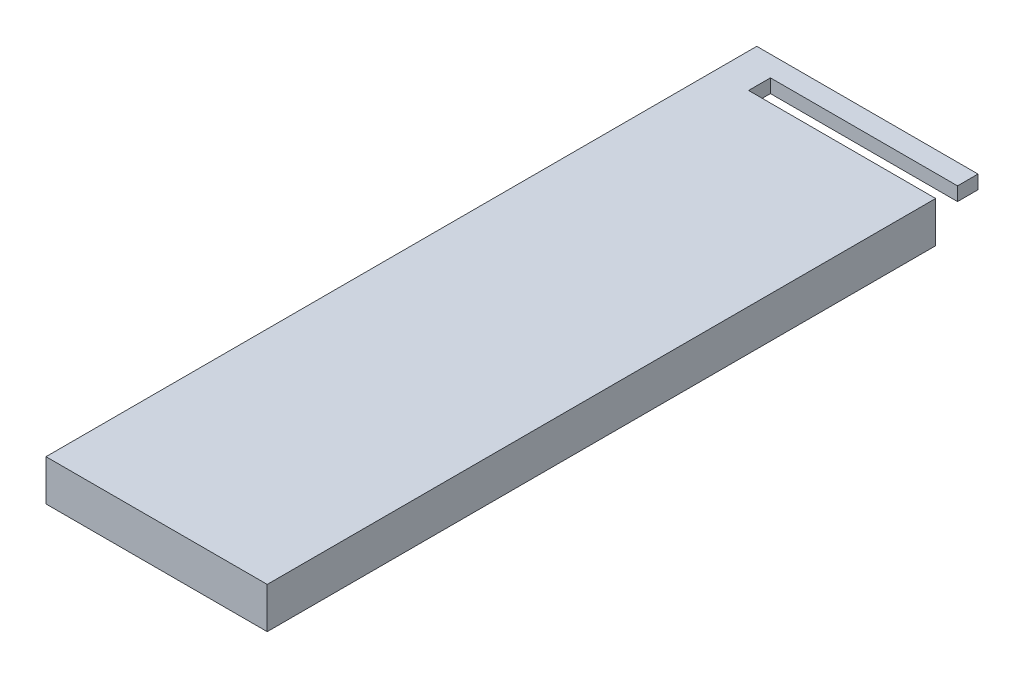
ISO-10303-21;
HEADER;
FILE_DESCRIPTION(('STEP AP214'),'2;1');
FILE_NAME('part.step','',(''),(''),'','','');
FILE_SCHEMA(('AUTOMOTIVE_DESIGN { 1 0 10303 214 1 1 1 1 }'));
ENDSEC;
DATA;
#1=APPLICATION_CONTEXT('core data for automotive mechanical design processes');
#2=APPLICATION_PROTOCOL_DEFINITION('international standard','automotive_design',2000,#1);
#3=PRODUCT_CONTEXT('',#1,'mechanical');
#4=PRODUCT('Part','Part','',(#3));
#5=PRODUCT_RELATED_PRODUCT_CATEGORY('part','',(#4));
#6=PRODUCT_DEFINITION_FORMATION('','',#4);
#7=PRODUCT_DEFINITION_CONTEXT('part definition',#1,'design');
#8=PRODUCT_DEFINITION('design','',#6,#7);
#9=PRODUCT_DEFINITION_SHAPE('','',#8);
#10=(LENGTH_UNIT() NAMED_UNIT(*) SI_UNIT(.MILLI.,.METRE.));
#11=(NAMED_UNIT(*) PLANE_ANGLE_UNIT() SI_UNIT($,.RADIAN.));
#12=(NAMED_UNIT(*) SI_UNIT($,.STERADIAN.) SOLID_ANGLE_UNIT());
#13=UNCERTAINTY_MEASURE_WITH_UNIT(LENGTH_MEASURE(1.E-05),#10,'distance_accuracy_value','');
#14=(GEOMETRIC_REPRESENTATION_CONTEXT(3) GLOBAL_UNCERTAINTY_ASSIGNED_CONTEXT((#13)) GLOBAL_UNIT_ASSIGNED_CONTEXT((#10,
#11,#12)) REPRESENTATION_CONTEXT('',''));
#15=CARTESIAN_POINT('',(0.,0.,0.));
#16=DIRECTION('',(0.,0.,1.));
#17=DIRECTION('',(1.,0.,0.));
#18=AXIS2_PLACEMENT_3D('',#15,#16,#17);
#19=CARTESIAN_POINT('',(30.4,2.,-95.9));
#20=DIRECTION('',(0.,0.,1.));
#21=DIRECTION('',(1.,0.,0.));
#22=AXIS2_PLACEMENT_3D('',#19,#20,#21);
#23=PLANE('',#22);
#24=DIRECTION('',(0.,-1.,0.));
#25=VECTOR('',#24,1.);
#26=CARTESIAN_POINT('',(5.,2.,-95.9));
#27=LINE('',#26,#25);
#28=CARTESIAN_POINT('',(5.,2.,-95.9));
#29=VERTEX_POINT('',#28);
#30=CARTESIAN_POINT('',(5.,0.,-95.9));
#31=VERTEX_POINT('',#30);
#32=EDGE_CURVE('E52',#29,#31,#27,.T.);
#33=ORIENTED_EDGE('',*,*,#32,.F.);
#34=DIRECTION('',(-1.,0.,0.));
#35=VECTOR('',#34,1.);
#36=CARTESIAN_POINT('',(30.4,2.,-95.9));
#37=LINE('',#36,#35);
#38=CARTESIAN_POINT('',(32.4,2.,-95.9));
#39=VERTEX_POINT('',#38);
#40=EDGE_CURVE('E11',#39,#29,#37,.T.);
#41=ORIENTED_EDGE('',*,*,#40,.F.);
#42=DIRECTION('',(0.,1.,0.));
#43=VECTOR('',#42,1.);
#44=CARTESIAN_POINT('',(32.4,-4.,-95.9));
#45=LINE('',#44,#43);
#46=CARTESIAN_POINT('',(32.4,-4.,-95.9));
#47=VERTEX_POINT('',#46);
#48=EDGE_CURVE('E181',#47,#39,#45,.T.);
#49=ORIENTED_EDGE('',*,*,#48,.F.);
#50=DIRECTION('',(1.,0.,0.));
#51=VECTOR('',#50,1.);
#52=CARTESIAN_POINT('',(0.,-4.,-95.9));
#53=LINE('',#52,#51);
#54=CARTESIAN_POINT('',(30.4,-4.,-95.9));
#55=VERTEX_POINT('',#54);
#56=EDGE_CURVE('E162',#55,#47,#53,.T.);
#57=ORIENTED_EDGE('',*,*,#56,.F.);
#58=DIRECTION('',(0.,1.,0.));
#59=VECTOR('',#58,1.);
#60=CARTESIAN_POINT('',(30.4,-4.,-95.9));
#61=LINE('',#60,#59);
#62=CARTESIAN_POINT('',(30.4,0.,-95.9));
#63=VERTEX_POINT('',#62);
#64=EDGE_CURVE('E178',#55,#63,#61,.T.);
#65=ORIENTED_EDGE('',*,*,#64,.T.);
#66=DIRECTION('',(-1.,0.,0.));
#67=VECTOR('',#66,1.);
#68=CARTESIAN_POINT('',(30.4,0.,-95.9));
#69=LINE('',#68,#67);
#70=EDGE_CURVE('E39',#63,#31,#69,.T.);
#71=ORIENTED_EDGE('',*,*,#70,.T.);
#72=EDGE_LOOP('',(#33,#41,#49,#57,#65,#71));
#73=FACE_BOUND('',#72,.T.);
#74=ADVANCED_FACE('F35',(#73),#23,.F.);
#75=CARTESIAN_POINT('',(0.,2.,0.));
#76=DIRECTION('',(1.,0.,0.));
#77=DIRECTION('',(0.,0.,-1.));
#78=AXIS2_PLACEMENT_3D('',#75,#76,#77);
#79=PLANE('',#78);
#80=DIRECTION('',(0.,0.,1.));
#81=VECTOR('',#80,1.);
#82=CARTESIAN_POINT('',(0.,0.,0.));
#83=LINE('',#82,#81);
#84=CARTESIAN_POINT('',(0.,0.,-102.1));
#85=VERTEX_POINT('',#84);
#86=CARTESIAN_POINT('',(0.,0.,0.));
#87=VERTEX_POINT('',#86);
#88=EDGE_CURVE('E174',#85,#87,#83,.T.);
#89=ORIENTED_EDGE('',*,*,#88,.T.);
#90=DIRECTION('',(0.,1.,0.));
#91=VECTOR('',#90,1.);
#92=CARTESIAN_POINT('',(0.,-4.,0.));
#93=LINE('',#92,#91);
#94=CARTESIAN_POINT('',(0.,-4.,0.));
#95=VERTEX_POINT('',#94);
#96=EDGE_CURVE('E171',#95,#87,#93,.T.);
#97=ORIENTED_EDGE('',*,*,#96,.F.);
#98=DIRECTION('',(0.,0.,-1.));
#99=VECTOR('',#98,1.);
#100=CARTESIAN_POINT('',(0.,-4.,0.));
#101=LINE('',#100,#99);
#102=CARTESIAN_POINT('',(0.,-4.,2.));
#103=VERTEX_POINT('',#102);
#104=EDGE_CURVE('E154',#103,#95,#101,.T.);
#105=ORIENTED_EDGE('',*,*,#104,.F.);
#106=DIRECTION('',(0.,1.,0.));
#107=VECTOR('',#106,1.);
#108=CARTESIAN_POINT('',(0.,-4.,2.));
#109=LINE('',#108,#107);
#110=CARTESIAN_POINT('',(0.,2.,2.));
#111=VERTEX_POINT('',#110);
#112=EDGE_CURVE('E125',#103,#111,#109,.T.);
#113=ORIENTED_EDGE('',*,*,#112,.T.);
#114=DIRECTION('',(0.,0.,1.));
#115=VECTOR('',#114,1.);
#116=CARTESIAN_POINT('',(0.,2.,0.));
#117=LINE('',#116,#115);
#118=CARTESIAN_POINT('',(0.,2.,-102.1));
#119=VERTEX_POINT('',#118);
#120=EDGE_CURVE('E44',#119,#111,#117,.T.);
#121=ORIENTED_EDGE('',*,*,#120,.F.);
#122=DIRECTION('',(0.,-1.,0.));
#123=VECTOR('',#122,1.);
#124=CARTESIAN_POINT('',(0.,2.,-102.1));
#125=LINE('',#124,#123);
#126=EDGE_CURVE('E122',#119,#85,#125,.T.);
#127=ORIENTED_EDGE('',*,*,#126,.T.);
#128=EDGE_LOOP('',(#89,#97,#105,#113,#121,#127));
#129=FACE_BOUND('',#128,.T.);
#130=ADVANCED_FACE('F37',(#129),#79,.F.);
#131=CARTESIAN_POINT('',(0.,2.,0.));
#132=DIRECTION('',(0.,1.,0.));
#133=DIRECTION('',(0.,0.,1.));
#134=AXIS2_PLACEMENT_3D('',#131,#132,#133);
#135=PLANE('',#134);
#136=ORIENTED_EDGE('',*,*,#40,.T.);
#137=DIRECTION('',(0.,0.,-1.));
#138=VECTOR('',#137,1.);
#139=CARTESIAN_POINT('',(5.,2.,0.));
#140=LINE('',#139,#138);
#141=CARTESIAN_POINT('',(5.,2.,-99.1));
#142=VERTEX_POINT('',#141);
#143=EDGE_CURVE('E146',#29,#142,#140,.T.);
#144=ORIENTED_EDGE('',*,*,#143,.T.);
#145=DIRECTION('',(-1.,0.,0.));
#146=VECTOR('',#145,1.);
#147=CARTESIAN_POINT('',(0.,2.,-99.1));
#148=LINE('',#147,#146);
#149=CARTESIAN_POINT('',(32.4,2.,-99.1));
#150=VERTEX_POINT('',#149);
#151=EDGE_CURVE('E150',#150,#142,#148,.T.);
#152=ORIENTED_EDGE('',*,*,#151,.F.);
#153=DIRECTION('',(0.,0.,-1.));
#154=VECTOR('',#153,1.);
#155=CARTESIAN_POINT('',(32.4,2.,0.));
#156=LINE('',#155,#154);
#157=CARTESIAN_POINT('',(32.4,2.,-102.1));
#158=VERTEX_POINT('',#157);
#159=EDGE_CURVE('E135',#150,#158,#156,.T.);
#160=ORIENTED_EDGE('',*,*,#159,.T.);
#161=DIRECTION('',(-1.,0.,0.));
#162=VECTOR('',#161,1.);
#163=CARTESIAN_POINT('',(0.,2.,-102.1));
#164=LINE('',#163,#162);
#165=EDGE_CURVE('E131',#158,#119,#164,.T.);
#166=ORIENTED_EDGE('',*,*,#165,.T.);
#167=ORIENTED_EDGE('',*,*,#120,.T.);
#168=DIRECTION('',(-1.,0.,0.));
#169=VECTOR('',#168,1.);
#170=CARTESIAN_POINT('',(0.,2.,2.));
#171=LINE('',#170,#169);
#172=CARTESIAN_POINT('',(32.4,2.,2.));
#173=VERTEX_POINT('',#172);
#174=EDGE_CURVE('E168',#173,#111,#171,.T.);
#175=ORIENTED_EDGE('',*,*,#174,.F.);
#176=DIRECTION('',(0.,0.,1.));
#177=VECTOR('',#176,1.);
#178=CARTESIAN_POINT('',(32.4,2.,0.));
#179=LINE('',#178,#177);
#180=EDGE_CURVE('E158',#39,#173,#179,.T.);
#181=ORIENTED_EDGE('',*,*,#180,.F.);
#182=EDGE_LOOP('',(#136,#144,#152,#160,#166,#167,#175,#181));
#183=FACE_BOUND('',#182,.T.);
#184=ADVANCED_FACE('F132',(#183),#135,.T.);
#185=CARTESIAN_POINT('',(0.,0.,0.));
#186=DIRECTION('',(0.,1.,0.));
#187=DIRECTION('',(0.,0.,1.));
#188=AXIS2_PLACEMENT_3D('',#185,#186,#187);
#189=PLANE('',#188);
#190=ORIENTED_EDGE('',*,*,#88,.F.);
#191=DIRECTION('',(-1.,0.,0.));
#192=VECTOR('',#191,1.);
#193=CARTESIAN_POINT('',(0.,0.,-102.1));
#194=LINE('',#193,#192);
#195=CARTESIAN_POINT('',(32.4,0.,-102.1));
#196=VERTEX_POINT('',#195);
#197=EDGE_CURVE('E144',#196,#85,#194,.T.);
#198=ORIENTED_EDGE('',*,*,#197,.F.);
#199=DIRECTION('',(0.,0.,-1.));
#200=VECTOR('',#199,1.);
#201=CARTESIAN_POINT('',(32.4,0.,0.));
#202=LINE('',#201,#200);
#203=CARTESIAN_POINT('',(32.4,0.,-99.1));
#204=VERTEX_POINT('',#203);
#205=EDGE_CURVE('E207',#204,#196,#202,.T.);
#206=ORIENTED_EDGE('',*,*,#205,.F.);
#207=DIRECTION('',(-1.,0.,0.));
#208=VECTOR('',#207,1.);
#209=CARTESIAN_POINT('',(0.,0.,-99.1));
#210=LINE('',#209,#208);
#211=CARTESIAN_POINT('',(5.,0.,-99.1));
#212=VERTEX_POINT('',#211);
#213=EDGE_CURVE('E205',#204,#212,#210,.T.);
#214=ORIENTED_EDGE('',*,*,#213,.T.);
#215=DIRECTION('',(0.,0.,-1.));
#216=VECTOR('',#215,1.);
#217=CARTESIAN_POINT('',(5.,0.,0.));
#218=LINE('',#217,#216);
#219=EDGE_CURVE('E139',#31,#212,#218,.T.);
#220=ORIENTED_EDGE('',*,*,#219,.F.);
#221=ORIENTED_EDGE('',*,*,#70,.F.);
#222=DIRECTION('',(0.,0.,-1.));
#223=VECTOR('',#222,1.);
#224=CARTESIAN_POINT('',(30.4,0.,0.));
#225=LINE('',#224,#223);
#226=CARTESIAN_POINT('',(30.4,0.,0.));
#227=VERTEX_POINT('',#226);
#228=EDGE_CURVE('E59',#227,#63,#225,.T.);
#229=ORIENTED_EDGE('',*,*,#228,.F.);
#230=DIRECTION('',(1.,0.,0.));
#231=VECTOR('',#230,1.);
#232=CARTESIAN_POINT('',(0.,0.,0.));
#233=LINE('',#232,#231);
#234=EDGE_CURVE('E189',#87,#227,#233,.T.);
#235=ORIENTED_EDGE('',*,*,#234,.F.);
#236=EDGE_LOOP('',(#190,#198,#206,#214,#220,#221,#229,#235));
#237=FACE_BOUND('',#236,.T.);
#238=ADVANCED_FACE('F202',(#237),#189,.F.);
#239=CARTESIAN_POINT('',(0.,-4.,0.));
#240=DIRECTION('',(0.,0.,1.));
#241=DIRECTION('',(1.,0.,0.));
#242=AXIS2_PLACEMENT_3D('',#239,#240,#241);
#243=PLANE('',#242);
#244=ORIENTED_EDGE('',*,*,#96,.T.);
#245=ORIENTED_EDGE('',*,*,#234,.T.);
#246=DIRECTION('',(0.,1.,0.));
#247=VECTOR('',#246,1.);
#248=CARTESIAN_POINT('',(30.4,-4.,0.));
#249=LINE('',#248,#247);
#250=CARTESIAN_POINT('',(30.4,-4.,0.));
#251=VERTEX_POINT('',#250);
#252=EDGE_CURVE('E175',#251,#227,#249,.T.);
#253=ORIENTED_EDGE('',*,*,#252,.F.);
#254=DIRECTION('',(1.,0.,0.));
#255=VECTOR('',#254,1.);
#256=CARTESIAN_POINT('',(0.,-4.,0.));
#257=LINE('',#256,#255);
#258=EDGE_CURVE('E166',#95,#251,#257,.T.);
#259=ORIENTED_EDGE('',*,*,#258,.F.);
#260=EDGE_LOOP('',(#244,#245,#253,#259));
#261=FACE_BOUND('',#260,.T.);
#262=ADVANCED_FACE('F232',(#261),#243,.F.);
#263=CARTESIAN_POINT('',(30.4,-4.,0.));
#264=DIRECTION('',(1.,0.,0.));
#265=DIRECTION('',(0.,0.,-1.));
#266=AXIS2_PLACEMENT_3D('',#263,#264,#265);
#267=PLANE('',#266);
#268=ORIENTED_EDGE('',*,*,#252,.T.);
#269=ORIENTED_EDGE('',*,*,#228,.T.);
#270=ORIENTED_EDGE('',*,*,#64,.F.);
#271=DIRECTION('',(0.,0.,-1.));
#272=VECTOR('',#271,1.);
#273=CARTESIAN_POINT('',(30.4,-4.,0.));
#274=LINE('',#273,#272);
#275=EDGE_CURVE('E164',#251,#55,#274,.T.);
#276=ORIENTED_EDGE('',*,*,#275,.F.);
#277=EDGE_LOOP('',(#268,#269,#270,#276));
#278=FACE_BOUND('',#277,.T.);
#279=ADVANCED_FACE('F230',(#278),#267,.F.);
#280=CARTESIAN_POINT('',(32.4,-4.,0.));
#281=DIRECTION('',(-1.,0.,0.));
#282=DIRECTION('',(0.,0.,1.));
#283=AXIS2_PLACEMENT_3D('',#280,#281,#282);
#284=PLANE('',#283);
#285=ORIENTED_EDGE('',*,*,#180,.T.);
#286=DIRECTION('',(0.,1.,0.));
#287=VECTOR('',#286,1.);
#288=CARTESIAN_POINT('',(32.4,-4.,2.));
#289=LINE('',#288,#287);
#290=CARTESIAN_POINT('',(32.4,-4.,2.));
#291=VERTEX_POINT('',#290);
#292=EDGE_CURVE('E184',#291,#173,#289,.T.);
#293=ORIENTED_EDGE('',*,*,#292,.F.);
#294=DIRECTION('',(0.,0.,1.));
#295=VECTOR('',#294,1.);
#296=CARTESIAN_POINT('',(32.4,-4.,0.));
#297=LINE('',#296,#295);
#298=EDGE_CURVE('E160',#47,#291,#297,.T.);
#299=ORIENTED_EDGE('',*,*,#298,.F.);
#300=ORIENTED_EDGE('',*,*,#48,.T.);
#301=EDGE_LOOP('',(#285,#293,#299,#300));
#302=FACE_BOUND('',#301,.T.);
#303=ADVANCED_FACE('F223',(#302),#284,.F.);
#304=CARTESIAN_POINT('',(0.,-4.,2.));
#305=DIRECTION('',(0.,0.,-1.));
#306=DIRECTION('',(-1.,0.,0.));
#307=AXIS2_PLACEMENT_3D('',#304,#305,#306);
#308=PLANE('',#307);
#309=ORIENTED_EDGE('',*,*,#174,.T.);
#310=ORIENTED_EDGE('',*,*,#112,.F.);
#311=DIRECTION('',(-1.,0.,0.));
#312=VECTOR('',#311,1.);
#313=CARTESIAN_POINT('',(0.,-4.,2.));
#314=LINE('',#313,#312);
#315=EDGE_CURVE('E157',#291,#103,#314,.T.);
#316=ORIENTED_EDGE('',*,*,#315,.F.);
#317=ORIENTED_EDGE('',*,*,#292,.T.);
#318=EDGE_LOOP('',(#309,#310,#316,#317));
#319=FACE_BOUND('',#318,.T.);
#320=ADVANCED_FACE('F238',(#319),#308,.F.);
#321=CARTESIAN_POINT('',(0.,-4.,0.));
#322=DIRECTION('',(0.,1.,0.));
#323=DIRECTION('',(0.,0.,1.));
#324=AXIS2_PLACEMENT_3D('',#321,#322,#323);
#325=PLANE('',#324);
#326=ORIENTED_EDGE('',*,*,#104,.T.);
#327=ORIENTED_EDGE('',*,*,#258,.T.);
#328=ORIENTED_EDGE('',*,*,#275,.T.);
#329=ORIENTED_EDGE('',*,*,#56,.T.);
#330=ORIENTED_EDGE('',*,*,#298,.T.);
#331=ORIENTED_EDGE('',*,*,#315,.T.);
#332=EDGE_LOOP('',(#326,#327,#328,#329,#330,#331));
#333=FACE_BOUND('',#332,.T.);
#334=ADVANCED_FACE('F227',(#333),#325,.F.);
#335=CARTESIAN_POINT('',(5.,2.,0.));
#336=DIRECTION('',(-1.,0.,0.));
#337=DIRECTION('',(0.,0.,1.));
#338=AXIS2_PLACEMENT_3D('',#335,#336,#337);
#339=PLANE('',#338);
#340=ORIENTED_EDGE('',*,*,#219,.T.);
#341=DIRECTION('',(0.,-1.,0.));
#342=VECTOR('',#341,1.);
#343=CARTESIAN_POINT('',(5.,2.,-99.1));
#344=LINE('',#343,#342);
#345=EDGE_CURVE('E200',#142,#212,#344,.T.);
#346=ORIENTED_EDGE('',*,*,#345,.F.);
#347=ORIENTED_EDGE('',*,*,#143,.F.);
#348=ORIENTED_EDGE('',*,*,#32,.T.);
#349=EDGE_LOOP('',(#340,#346,#347,#348));
#350=FACE_BOUND('',#349,.T.);
#351=ADVANCED_FACE('F197',(#350),#339,.F.);
#352=CARTESIAN_POINT('',(0.,2.,-99.1));
#353=DIRECTION('',(0.,0.,1.));
#354=DIRECTION('',(1.,0.,0.));
#355=AXIS2_PLACEMENT_3D('',#352,#353,#354);
#356=PLANE('',#355);
#357=ORIENTED_EDGE('',*,*,#213,.F.);
#358=DIRECTION('',(0.,-1.,0.));
#359=VECTOR('',#358,1.);
#360=CARTESIAN_POINT('',(32.4,2.,-99.1));
#361=LINE('',#360,#359);
#362=EDGE_CURVE('E148',#150,#204,#361,.T.);
#363=ORIENTED_EDGE('',*,*,#362,.F.);
#364=ORIENTED_EDGE('',*,*,#151,.T.);
#365=ORIENTED_EDGE('',*,*,#345,.T.);
#366=EDGE_LOOP('',(#357,#363,#364,#365));
#367=FACE_BOUND('',#366,.T.);
#368=ADVANCED_FACE('F215',(#367),#356,.T.);
#369=CARTESIAN_POINT('',(32.4,2.,0.));
#370=DIRECTION('',(-1.,0.,0.));
#371=DIRECTION('',(0.,0.,1.));
#372=AXIS2_PLACEMENT_3D('',#369,#370,#371);
#373=PLANE('',#372);
#374=ORIENTED_EDGE('',*,*,#205,.T.);
#375=DIRECTION('',(0.,-1.,0.));
#376=VECTOR('',#375,1.);
#377=CARTESIAN_POINT('',(32.4,2.,-102.1));
#378=LINE('',#377,#376);
#379=EDGE_CURVE('E145',#158,#196,#378,.T.);
#380=ORIENTED_EDGE('',*,*,#379,.F.);
#381=ORIENTED_EDGE('',*,*,#159,.F.);
#382=ORIENTED_EDGE('',*,*,#362,.T.);
#383=EDGE_LOOP('',(#374,#380,#381,#382));
#384=FACE_BOUND('',#383,.T.);
#385=ADVANCED_FACE('F212',(#384),#373,.F.);
#386=CARTESIAN_POINT('',(0.,2.,-102.1));
#387=DIRECTION('',(0.,0.,1.));
#388=DIRECTION('',(1.,0.,0.));
#389=AXIS2_PLACEMENT_3D('',#386,#387,#388);
#390=PLANE('',#389);
#391=ORIENTED_EDGE('',*,*,#197,.T.);
#392=ORIENTED_EDGE('',*,*,#126,.F.);
#393=ORIENTED_EDGE('',*,*,#165,.F.);
#394=ORIENTED_EDGE('',*,*,#379,.T.);
#395=EDGE_LOOP('',(#391,#392,#393,#394));
#396=FACE_BOUND('',#395,.T.);
#397=ADVANCED_FACE('F142',(#396),#390,.F.);
#398=CLOSED_SHELL('',(#74,#130,#184,#238,#262,#279,#303,#320,#334,#351,#368,#385,#397));
#399=MANIFOLD_SOLID_BREP('B2',#398);
#400=ADVANCED_BREP_SHAPE_REPRESENTATION('',(#18,#399),#14);
#401=SHAPE_DEFINITION_REPRESENTATION(#9,#400);
ENDSEC;
END-ISO-10303-21;
